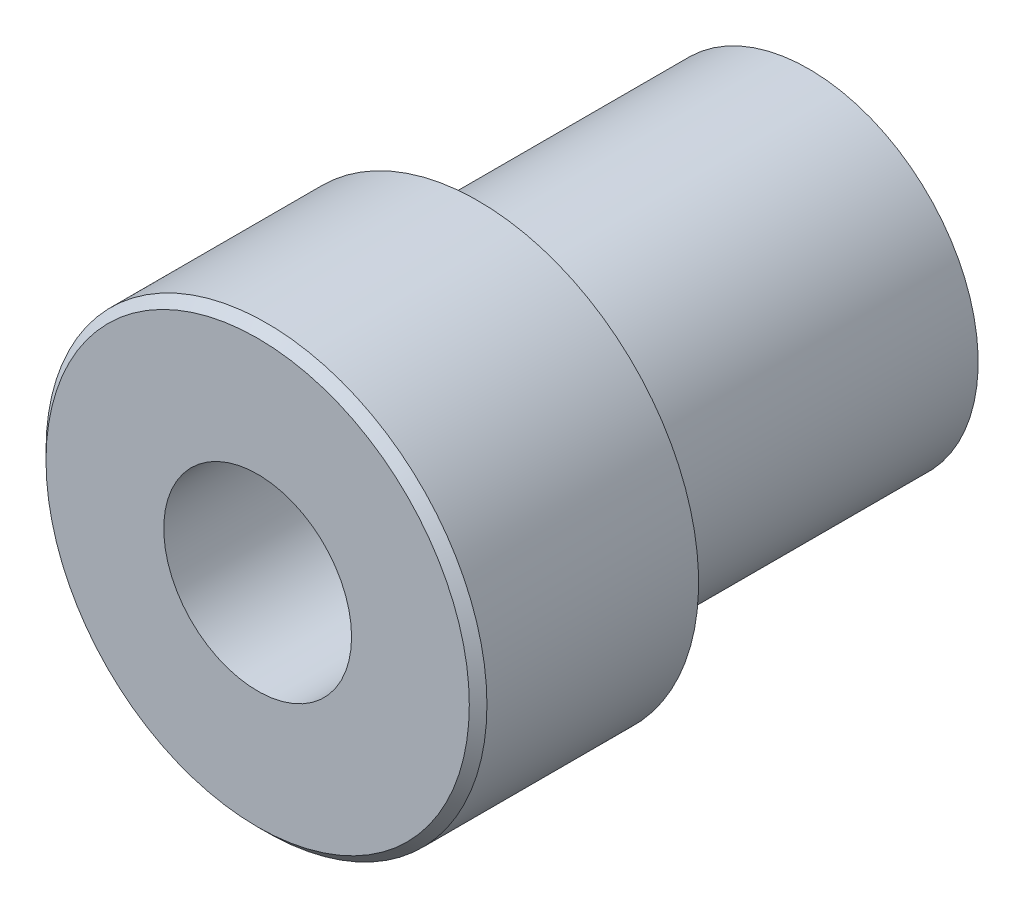
ISO-10303-21;
HEADER;
FILE_DESCRIPTION(('STEP AP214'),'2;1');
FILE_NAME('part.step','',(''),(''),'','','');
FILE_SCHEMA(('AUTOMOTIVE_DESIGN { 1 0 10303 214 1 1 1 1 }'));
ENDSEC;
DATA;
#1=APPLICATION_CONTEXT('core data for automotive mechanical design processes');
#2=APPLICATION_PROTOCOL_DEFINITION('international standard','automotive_design',2000,#1);
#3=PRODUCT_CONTEXT('',#1,'mechanical');
#4=PRODUCT('Part','Part','',(#3));
#5=PRODUCT_RELATED_PRODUCT_CATEGORY('part','',(#4));
#6=PRODUCT_DEFINITION_FORMATION('','',#4);
#7=PRODUCT_DEFINITION_CONTEXT('part definition',#1,'design');
#8=PRODUCT_DEFINITION('design','',#6,#7);
#9=PRODUCT_DEFINITION_SHAPE('','',#8);
#10=(LENGTH_UNIT() NAMED_UNIT(*) SI_UNIT(.MILLI.,.METRE.));
#11=(NAMED_UNIT(*) PLANE_ANGLE_UNIT() SI_UNIT($,.RADIAN.));
#12=(NAMED_UNIT(*) SI_UNIT($,.STERADIAN.) SOLID_ANGLE_UNIT());
#13=UNCERTAINTY_MEASURE_WITH_UNIT(LENGTH_MEASURE(1.E-05),#10,'distance_accuracy_value','');
#14=(GEOMETRIC_REPRESENTATION_CONTEXT(3) GLOBAL_UNCERTAINTY_ASSIGNED_CONTEXT((#13)) GLOBAL_UNIT_ASSIGNED_CONTEXT((#10,
#11,#12)) REPRESENTATION_CONTEXT('',''));
#15=CARTESIAN_POINT('',(0.,0.,0.));
#16=DIRECTION('',(0.,0.,1.));
#17=DIRECTION('',(1.,0.,0.));
#18=AXIS2_PLACEMENT_3D('',#15,#16,#17);
#19=CARTESIAN_POINT('',(0.,0.,15.875));
#20=DIRECTION('',(0.,0.,-1.));
#21=DIRECTION('',(-1.,0.,0.));
#22=AXIS2_PLACEMENT_3D('',#19,#20,#21);
#23=CYLINDRICAL_SURFACE('',#22,6.35);
#24=CARTESIAN_POINT('',(0.,0.,15.621));
#25=DIRECTION('',(0.,0.,1.));
#26=DIRECTION('',(1.,0.,0.));
#27=AXIS2_PLACEMENT_3D('',#24,#25,#26);
#28=CIRCLE('',#27,6.35);
#29=CARTESIAN_POINT('',(6.35,0.,15.621));
#30=VERTEX_POINT('',#29);
#31=EDGE_CURVE('E13',#30,#30,#28,.F.);
#32=ORIENTED_EDGE('',*,*,#31,.T.);
#33=EDGE_LOOP('',(#32));
#34=FACE_BOUND('',#33,.T.);
#35=CARTESIAN_POINT('',(0.,0.,9.525));
#36=DIRECTION('',(0.,0.,-1.));
#37=DIRECTION('',(-1.,0.,0.));
#38=AXIS2_PLACEMENT_3D('',#35,#36,#37);
#39=CIRCLE('',#38,6.35);
#40=CARTESIAN_POINT('',(-6.35,0.,9.525));
#41=VERTEX_POINT('',#40);
#42=EDGE_CURVE('E57',#41,#41,#39,.T.);
#43=ORIENTED_EDGE('',*,*,#42,.F.);
#44=EDGE_LOOP('',(#43));
#45=FACE_BOUND('',#44,.T.);
#46=ADVANCED_FACE('F53',(#34,#45),#23,.T.);
#47=CARTESIAN_POINT('',(0.,0.,15.875));
#48=DIRECTION('',(0.,0.,1.));
#49=DIRECTION('',(1.,0.,0.));
#50=AXIS2_PLACEMENT_3D('',#47,#48,#49);
#51=PLANE('',#50);
#52=CARTESIAN_POINT('',(0.,0.,15.875));
#53=DIRECTION('',(0.,0.,1.));
#54=DIRECTION('',(1.,0.,0.));
#55=AXIS2_PLACEMENT_3D('',#52,#53,#54);
#56=CIRCLE('',#55,2.7051);
#57=CARTESIAN_POINT('',(2.7051,0.,15.875));
#58=VERTEX_POINT('',#57);
#59=EDGE_CURVE('E82',#58,#58,#56,.T.);
#60=ORIENTED_EDGE('',*,*,#59,.F.);
#61=EDGE_LOOP('',(#60));
#62=FACE_BOUND('',#61,.T.);
#63=CARTESIAN_POINT('',(0.,0.,15.875));
#64=DIRECTION('',(0.,0.,1.));
#65=DIRECTION('',(1.,0.,0.));
#66=AXIS2_PLACEMENT_3D('',#63,#64,#65);
#67=CIRCLE('',#66,6.096);
#68=CARTESIAN_POINT('',(6.096,0.,15.875));
#69=VERTEX_POINT('',#68);
#70=EDGE_CURVE('E62',#69,#69,#67,.T.);
#71=ORIENTED_EDGE('',*,*,#70,.T.);
#72=EDGE_LOOP('',(#71));
#73=FACE_BOUND('',#72,.T.);
#74=ADVANCED_FACE('F90',(#62,#73),#51,.T.);
#75=CARTESIAN_POINT('',(0.,0.,15.875));
#76=DIRECTION('',(0.,0.,-1.));
#77=DIRECTION('',(-1.,0.,0.));
#78=AXIS2_PLACEMENT_3D('',#75,#76,#77);
#79=CONICAL_SURFACE('',#78,6.096,0.785398163397445);
#80=ORIENTED_EDGE('',*,*,#31,.F.);
#81=EDGE_LOOP('',(#80));
#82=FACE_BOUND('',#81,.T.);
#83=ORIENTED_EDGE('',*,*,#70,.F.);
#84=EDGE_LOOP('',(#83));
#85=FACE_BOUND('',#84,.T.);
#86=ADVANCED_FACE('F55',(#82,#85),#79,.T.);
#87=CARTESIAN_POINT('',(0.,0.,9.525));
#88=DIRECTION('',(0.,0.,-1.));
#89=DIRECTION('',(-1.,0.,0.));
#90=AXIS2_PLACEMENT_3D('',#87,#88,#89);
#91=PLANE('',#90);
#92=CARTESIAN_POINT('',(0.,0.,9.525));
#93=DIRECTION('',(0.,0.,-1.));
#94=DIRECTION('',(-1.,0.,0.));
#95=AXIS2_PLACEMENT_3D('',#92,#93,#94);
#96=CIRCLE('',#95,4.8768);
#97=CARTESIAN_POINT('',(-4.8768,0.,9.525));
#98=VERTEX_POINT('',#97);
#99=EDGE_CURVE('E74',#98,#98,#96,.T.);
#100=ORIENTED_EDGE('',*,*,#99,.F.);
#101=EDGE_LOOP('',(#100));
#102=FACE_BOUND('',#101,.T.);
#103=ORIENTED_EDGE('',*,*,#42,.T.);
#104=EDGE_LOOP('',(#103));
#105=FACE_BOUND('',#104,.T.);
#106=ADVANCED_FACE('F97',(#102,#105),#91,.T.);
#107=CARTESIAN_POINT('',(0.,0.,9.525));
#108=DIRECTION('',(0.,0.,-1.));
#109=DIRECTION('',(-1.,0.,0.));
#110=AXIS2_PLACEMENT_3D('',#107,#108,#109);
#111=CYLINDRICAL_SURFACE('',#110,4.8768);
#112=CARTESIAN_POINT('',(0.,0.,0.));
#113=DIRECTION('',(0.,0.,-1.));
#114=DIRECTION('',(-1.,0.,0.));
#115=AXIS2_PLACEMENT_3D('',#112,#113,#114);
#116=CIRCLE('',#115,4.8768);
#117=CARTESIAN_POINT('',(-4.8768,0.,0.));
#118=VERTEX_POINT('',#117);
#119=EDGE_CURVE('E70',#118,#118,#116,.T.);
#120=CARTESIAN_POINT('',(-4.8768,0.,9.525));
#121=CARTESIAN_POINT('',(-4.8768,0.,9.42578125));
#122=CARTESIAN_POINT('',(-4.8768,0.,9.3265625));
#123=CARTESIAN_POINT('',(-4.8768,0.,9.128125));
#124=CARTESIAN_POINT('',(-4.8768,0.,9.02890625));
#125=CARTESIAN_POINT('',(-4.8768,0.,8.83046875));
#126=CARTESIAN_POINT('',(-4.8768,0.,8.73125));
#127=CARTESIAN_POINT('',(-4.8768,0.,8.5328125));
#128=CARTESIAN_POINT('',(-4.8768,0.,8.43359375));
#129=CARTESIAN_POINT('',(-4.8768,0.,8.23515625));
#130=CARTESIAN_POINT('',(-4.8768,0.,8.1359375));
#131=CARTESIAN_POINT('',(-4.8768,0.,7.9375));
#132=CARTESIAN_POINT('',(-4.8768,0.,7.83828125));
#133=CARTESIAN_POINT('',(-4.8768,0.,7.63984375));
#134=CARTESIAN_POINT('',(-4.8768,0.,7.540625));
#135=CARTESIAN_POINT('',(-4.8768,0.,7.3421875));
#136=CARTESIAN_POINT('',(-4.8768,0.,7.24296875));
#137=CARTESIAN_POINT('',(-4.8768,0.,7.04453125));
#138=CARTESIAN_POINT('',(-4.8768,0.,6.9453125));
#139=CARTESIAN_POINT('',(-4.8768,0.,6.746875));
#140=CARTESIAN_POINT('',(-4.8768,0.,6.64765625));
#141=CARTESIAN_POINT('',(-4.8768,0.,6.44921875));
#142=CARTESIAN_POINT('',(-4.8768,0.,6.35));
#143=CARTESIAN_POINT('',(-4.8768,0.,6.1515625));
#144=CARTESIAN_POINT('',(-4.8768,0.,6.05234375));
#145=CARTESIAN_POINT('',(-4.8768,0.,5.85390625));
#146=CARTESIAN_POINT('',(-4.8768,0.,5.7546875));
#147=CARTESIAN_POINT('',(-4.8768,0.,5.55625));
#148=CARTESIAN_POINT('',(-4.8768,0.,5.45703125));
#149=CARTESIAN_POINT('',(-4.8768,0.,5.25859375));
#150=CARTESIAN_POINT('',(-4.8768,0.,5.159375));
#151=CARTESIAN_POINT('',(-4.8768,0.,4.9609375));
#152=CARTESIAN_POINT('',(-4.8768,0.,4.86171875));
#153=CARTESIAN_POINT('',(-4.8768,0.,4.66328125));
#154=CARTESIAN_POINT('',(-4.8768,0.,4.5640625));
#155=CARTESIAN_POINT('',(-4.8768,0.,4.365625));
#156=CARTESIAN_POINT('',(-4.8768,0.,4.26640625));
#157=CARTESIAN_POINT('',(-4.8768,0.,4.06796875));
#158=CARTESIAN_POINT('',(-4.8768,0.,3.96875));
#159=CARTESIAN_POINT('',(-4.8768,0.,3.7703125));
#160=CARTESIAN_POINT('',(-4.8768,0.,3.67109375));
#161=CARTESIAN_POINT('',(-4.8768,0.,3.47265625));
#162=CARTESIAN_POINT('',(-4.8768,0.,3.3734375));
#163=CARTESIAN_POINT('',(-4.8768,0.,3.175));
#164=CARTESIAN_POINT('',(-4.8768,0.,3.07578125));
#165=CARTESIAN_POINT('',(-4.8768,0.,2.87734375));
#166=CARTESIAN_POINT('',(-4.8768,0.,2.778125));
#167=CARTESIAN_POINT('',(-4.8768,0.,2.5796875));
#168=CARTESIAN_POINT('',(-4.8768,0.,2.48046875));
#169=CARTESIAN_POINT('',(-4.8768,0.,2.28203125));
#170=CARTESIAN_POINT('',(-4.8768,0.,2.1828125));
#171=CARTESIAN_POINT('',(-4.8768,0.,1.984375));
#172=CARTESIAN_POINT('',(-4.8768,0.,1.88515625));
#173=CARTESIAN_POINT('',(-4.8768,0.,1.68671875));
#174=CARTESIAN_POINT('',(-4.8768,0.,1.5875));
#175=CARTESIAN_POINT('',(-4.8768,0.,1.3890625));
#176=CARTESIAN_POINT('',(-4.8768,0.,1.28984375));
#177=CARTESIAN_POINT('',(-4.8768,0.,1.09140625));
#178=CARTESIAN_POINT('',(-4.8768,0.,0.992187500000001));
#179=CARTESIAN_POINT('',(-4.8768,0.,0.793750000000001));
#180=CARTESIAN_POINT('',(-4.8768,0.,0.69453125));
#181=CARTESIAN_POINT('',(-4.8768,0.,0.49609375));
#182=CARTESIAN_POINT('',(-4.8768,0.,0.396875));
#183=CARTESIAN_POINT('',(-4.8768,0.,0.1984375));
#184=CARTESIAN_POINT('',(-4.8768,0.,0.0992187500000001));
#185=CARTESIAN_POINT('',(-4.8768,0.,0.));
#186=B_SPLINE_CURVE_WITH_KNOTS('',3,(#120,#121,#122,#123,#124,#125,#126,#127,#128,#129,#130,
#131,#132,#133,#134,#135,#136,#137,#138,#139,#140,#141,#142,#143,#144,#145,#146,#147,#148,#149,
#150,#151,#152,#153,#154,#155,#156,#157,#158,#159,#160,#161,#162,#163,#164,#165,#166,#167,#168,
#169,#170,#171,#172,#173,#174,#175,#176,#177,#178,#179,#180,#181,#182,#183,#184,#185),
.UNSPECIFIED.,.F.,.F.,(4,2,2,2,2,2,2,2,2,2,2,2,2,2,2,2,2,2,2,2,2,2,2,2,2,2,2,2,2,2,2,2,4),(0.,
0.297656249999998,0.595312499999999,0.892968749999999,1.190625,1.48828125,1.7859375,2.08359375,
2.38125,2.67890625,2.9765625,3.27421875,3.571875,3.86953125,4.1671875,4.46484375,4.7625,
5.06015625,5.3578125,5.65546875,5.953125,6.25078125,6.5484375,6.84609375,7.14375,7.44140625,
7.7390625,8.03671875,8.334375,8.63203125,8.9296875,9.22734375,9.525),.UNSPECIFIED.);
#187=EDGE_CURVE('BSEAM102',#98,#118,#186,.T.);
#188=ORIENTED_EDGE('',*,*,#99,.T.);
#189=ORIENTED_EDGE('',*,*,#119,.F.);
#190=ORIENTED_EDGE('',*,*,#187,.T.);
#191=ORIENTED_EDGE('',*,*,#187,.F.);
#192=EDGE_LOOP('',(#188,#190,#189,#191));
#193=FACE_BOUND('',#192,.T.);
#194=ADVANCED_FACE('F102',(#193),#111,.T.);
#195=CARTESIAN_POINT('',(0.,0.,0.));
#196=DIRECTION('',(0.,0.,1.));
#197=DIRECTION('',(1.,0.,0.));
#198=AXIS2_PLACEMENT_3D('',#195,#196,#197);
#199=PLANE('',#198);
#200=CARTESIAN_POINT('',(0.,0.,0.));
#201=DIRECTION('',(0.,0.,1.));
#202=DIRECTION('',(1.,0.,0.));
#203=AXIS2_PLACEMENT_3D('',#200,#201,#202);
#204=CIRCLE('',#203,2.7051);
#205=CARTESIAN_POINT('',(2.7051,0.,0.));
#206=VERTEX_POINT('',#205);
#207=EDGE_CURVE('E75',#206,#206,#204,.T.);
#208=ORIENTED_EDGE('',*,*,#207,.T.);
#209=EDGE_LOOP('',(#208));
#210=FACE_BOUND('',#209,.T.);
#211=ORIENTED_EDGE('',*,*,#119,.T.);
#212=EDGE_LOOP('',(#211));
#213=FACE_BOUND('',#212,.T.);
#214=ADVANCED_FACE('F110',(#210,#213),#199,.F.);
#215=CARTESIAN_POINT('',(0.,0.,15.875));
#216=DIRECTION('',(0.,0.,1.));
#217=DIRECTION('',(1.,0.,0.));
#218=AXIS2_PLACEMENT_3D('',#215,#216,#217);
#219=CYLINDRICAL_SURFACE('',#218,2.7051);
#220=ORIENTED_EDGE('',*,*,#207,.F.);
#221=EDGE_LOOP('',(#220));
#222=FACE_BOUND('',#221,.T.);
#223=ORIENTED_EDGE('',*,*,#59,.T.);
#224=EDGE_LOOP('',(#223));
#225=FACE_BOUND('',#224,.T.);
#226=ADVANCED_FACE('F88',(#222,#225),#219,.F.);
#227=CLOSED_SHELL('',(#46,#74,#86,#106,#194,#214,#226));
#228=MANIFOLD_SOLID_BREP('B2',#227);
#229=ADVANCED_BREP_SHAPE_REPRESENTATION('',(#18,#228),#14);
#230=SHAPE_DEFINITION_REPRESENTATION(#9,#229);
ENDSEC;
END-ISO-10303-21;
